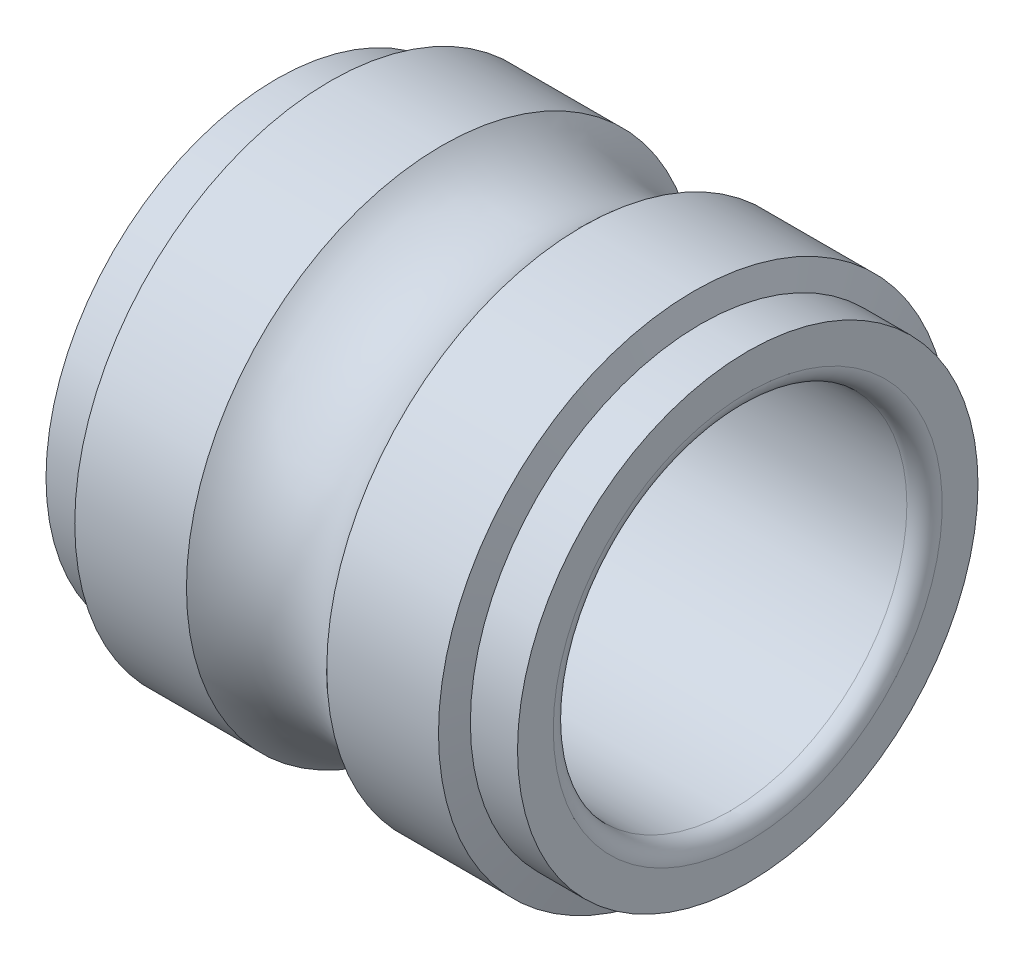
ISO-10303-21;
HEADER;
FILE_DESCRIPTION(('STEP AP214'),'2;1');
FILE_NAME('part.step','',(''),(''),'','','');
FILE_SCHEMA(('AUTOMOTIVE_DESIGN { 1 0 10303 214 1 1 1 1 }'));
ENDSEC;
DATA;
#1=APPLICATION_CONTEXT('core data for automotive mechanical design processes');
#2=APPLICATION_PROTOCOL_DEFINITION('international standard','automotive_design',2000,#1);
#3=PRODUCT_CONTEXT('',#1,'mechanical');
#4=PRODUCT('Part','Part','',(#3));
#5=PRODUCT_RELATED_PRODUCT_CATEGORY('part','',(#4));
#6=PRODUCT_DEFINITION_FORMATION('','',#4);
#7=PRODUCT_DEFINITION_CONTEXT('part definition',#1,'design');
#8=PRODUCT_DEFINITION('design','',#6,#7);
#9=PRODUCT_DEFINITION_SHAPE('','',#8);
#10=(LENGTH_UNIT() NAMED_UNIT(*) SI_UNIT(.MILLI.,.METRE.));
#11=(NAMED_UNIT(*) PLANE_ANGLE_UNIT() SI_UNIT($,.RADIAN.));
#12=(NAMED_UNIT(*) SI_UNIT($,.STERADIAN.) SOLID_ANGLE_UNIT());
#13=UNCERTAINTY_MEASURE_WITH_UNIT(LENGTH_MEASURE(1.E-05),#10,'distance_accuracy_value','');
#14=(GEOMETRIC_REPRESENTATION_CONTEXT(3) GLOBAL_UNCERTAINTY_ASSIGNED_CONTEXT((#13)) GLOBAL_UNIT_ASSIGNED_CONTEXT((#10,
#11,#12)) REPRESENTATION_CONTEXT('',''));
#15=CARTESIAN_POINT('',(0.,0.,0.));
#16=DIRECTION('',(0.,0.,1.));
#17=DIRECTION('',(1.,0.,0.));
#18=AXIS2_PLACEMENT_3D('',#15,#16,#17);
#19=CARTESIAN_POINT('',(0.15,0.,0.));
#20=DIRECTION('',(-1.,0.,0.));
#21=DIRECTION('',(0.,0.,1.));
#22=AXIS2_PLACEMENT_3D('',#19,#20,#21);
#23=CYLINDRICAL_SURFACE('',#22,2.16666666666667);
#24=CARTESIAN_POINT('',(2.5951190357119,0.,0.));
#25=DIRECTION('',(-1.,0.,0.));
#26=DIRECTION('',(0.,0.,1.));
#27=AXIS2_PLACEMENT_3D('',#24,#25,#26);
#28=CIRCLE('',#27,2.16666666666667);
#29=CARTESIAN_POINT('',(2.5951190357119,0.,2.16666666666667));
#30=VERTEX_POINT('',#29);
#31=EDGE_CURVE('E42',#30,#30,#28,.F.);
#32=ORIENTED_EDGE('',*,*,#31,.T.);
#33=EDGE_LOOP('',(#32));
#34=FACE_BOUND('',#33,.T.);
#35=CARTESIAN_POINT('',(3.54283750561469,0.,0.));
#36=DIRECTION('',(-1.,0.,0.));
#37=DIRECTION('',(0.,0.,1.));
#38=AXIS2_PLACEMENT_3D('',#35,#36,#37);
#39=CIRCLE('',#38,2.16666666666667);
#40=CARTESIAN_POINT('',(3.54283750561469,0.,2.16666666666667));
#41=VERTEX_POINT('',#40);
#42=EDGE_CURVE('E19',#41,#41,#39,.F.);
#43=ORIENTED_EDGE('',*,*,#42,.F.);
#44=EDGE_LOOP('',(#43));
#45=FACE_BOUND('',#44,.T.);
#46=ADVANCED_FACE('F15',(#34,#45),#23,.T.);
#47=CARTESIAN_POINT('',(4.,1.65,0.));
#48=DIRECTION('',(-1.,0.,0.));
#49=DIRECTION('',(0.,0.,1.));
#50=AXIS2_PLACEMENT_3D('',#47,#48,#49);
#51=PLANE('',#50);
#52=CARTESIAN_POINT('',(4.,0.,0.));
#53=DIRECTION('',(-1.,0.,0.));
#54=DIRECTION('',(0.,0.,1.));
#55=AXIS2_PLACEMENT_3D('',#52,#53,#54);
#56=CIRCLE('',#55,1.65);
#57=CARTESIAN_POINT('',(4.,0.,1.65));
#58=VERTEX_POINT('',#57);
#59=EDGE_CURVE('E34',#58,#58,#56,.T.);
#60=ORIENTED_EDGE('',*,*,#59,.T.);
#61=EDGE_LOOP('',(#60));
#62=FACE_BOUND('',#61,.T.);
#63=CARTESIAN_POINT('',(4.,0.,0.));
#64=DIRECTION('',(-1.,0.,0.));
#65=DIRECTION('',(0.,0.,1.));
#66=AXIS2_PLACEMENT_3D('',#63,#64,#65);
#67=CIRCLE('',#66,1.95333333333334);
#68=CARTESIAN_POINT('',(4.,0.,1.95333333333334));
#69=VERTEX_POINT('',#68);
#70=EDGE_CURVE('E55',#69,#69,#67,.T.);
#71=ORIENTED_EDGE('',*,*,#70,.F.);
#72=EDGE_LOOP('',(#71));
#73=FACE_BOUND('',#72,.T.);
#74=ADVANCED_FACE('F85',(#62,#73),#51,.F.);
#75=CARTESIAN_POINT('',(1.4048809642881,0.,0.));
#76=DIRECTION('',(1.,0.,0.));
#77=DIRECTION('',(0.,0.,-1.));
#78=AXIS2_PLACEMENT_3D('',#75,#76,#77);
#79=CIRCLE('',#78,2.16666666666667);
#80=CARTESIAN_POINT('',(1.4048809642881,0.,-2.16666666666667));
#81=VERTEX_POINT('',#80);
#82=EDGE_CURVE('E38',#81,#81,#79,.F.);
#83=ORIENTED_EDGE('',*,*,#82,.T.);
#84=EDGE_LOOP('',(#83));
#85=FACE_BOUND('',#84,.T.);
#86=CARTESIAN_POINT('',(0.457162494385307,0.,0.));
#87=DIRECTION('',(1.,0.,0.));
#88=DIRECTION('',(0.,0.,-1.));
#89=AXIS2_PLACEMENT_3D('',#86,#87,#88);
#90=CIRCLE('',#89,2.16666666666667);
#91=CARTESIAN_POINT('',(0.457162494385307,0.,-2.16666666666667));
#92=VERTEX_POINT('',#91);
#93=EDGE_CURVE('E43',#92,#92,#90,.F.);
#94=ORIENTED_EDGE('',*,*,#93,.F.);
#95=EDGE_LOOP('',(#94));
#96=FACE_BOUND('',#95,.T.);
#97=ADVANCED_FACE('F106',(#85,#96),#23,.T.);
#98=CARTESIAN_POINT('',(0.,1.65,0.));
#99=DIRECTION('',(-1.,0.,0.));
#100=DIRECTION('',(0.,0.,1.));
#101=AXIS2_PLACEMENT_3D('',#98,#99,#100);
#102=PLANE('',#101);
#103=CARTESIAN_POINT('',(0.,0.,0.));
#104=DIRECTION('',(-1.,0.,0.));
#105=DIRECTION('',(0.,0.,1.));
#106=AXIS2_PLACEMENT_3D('',#103,#104,#105);
#107=CIRCLE('',#106,1.65);
#108=CARTESIAN_POINT('',(0.,0.,1.65));
#109=VERTEX_POINT('',#108);
#110=EDGE_CURVE('E47',#109,#109,#107,.T.);
#111=ORIENTED_EDGE('',*,*,#110,.F.);
#112=EDGE_LOOP('',(#111));
#113=FACE_BOUND('',#112,.T.);
#114=CARTESIAN_POINT('',(0.,0.,0.));
#115=DIRECTION('',(-1.,0.,0.));
#116=DIRECTION('',(0.,0.,1.));
#117=AXIS2_PLACEMENT_3D('',#114,#115,#116);
#118=CIRCLE('',#117,1.95333333333334);
#119=CARTESIAN_POINT('',(0.,0.,1.95333333333334));
#120=VERTEX_POINT('',#119);
#121=EDGE_CURVE('E48',#120,#120,#118,.T.);
#122=ORIENTED_EDGE('',*,*,#121,.T.);
#123=EDGE_LOOP('',(#122));
#124=FACE_BOUND('',#123,.T.);
#125=ADVANCED_FACE('F101',(#113,#124),#102,.T.);
#126=CARTESIAN_POINT('',(0.15,0.,0.));
#127=DIRECTION('',(-1.,0.,0.));
#128=DIRECTION('',(0.,0.,1.));
#129=AXIS2_PLACEMENT_3D('',#126,#127,#128);
#130=TOROIDAL_SURFACE('',#129,1.65,0.15);
#131=CARTESIAN_POINT('',(0.15,0.,0.));
#132=DIRECTION('',(-1.,0.,0.));
#133=DIRECTION('',(0.,0.,1.));
#134=AXIS2_PLACEMENT_3D('',#131,#132,#133);
#135=CIRCLE('',#134,1.5);
#136=CARTESIAN_POINT('',(0.15,0.,1.5));
#137=VERTEX_POINT('',#136);
#138=EDGE_CURVE('E10',#137,#137,#135,.T.);
#139=ORIENTED_EDGE('',*,*,#138,.F.);
#140=EDGE_LOOP('',(#139));
#141=FACE_BOUND('',#140,.T.);
#142=ORIENTED_EDGE('',*,*,#110,.T.);
#143=EDGE_LOOP('',(#142));
#144=FACE_BOUND('',#143,.T.);
#145=ADVANCED_FACE('F17',(#141,#144),#130,.T.);
#146=CARTESIAN_POINT('',(0.15,0.,0.));
#147=DIRECTION('',(-1.,0.,0.));
#148=DIRECTION('',(0.,0.,1.));
#149=AXIS2_PLACEMENT_3D('',#146,#147,#148);
#150=CYLINDRICAL_SURFACE('',#149,1.5);
#151=CARTESIAN_POINT('',(3.85,0.,0.));
#152=DIRECTION('',(-1.,0.,0.));
#153=DIRECTION('',(0.,0.,1.));
#154=AXIS2_PLACEMENT_3D('',#151,#152,#153);
#155=CIRCLE('',#154,1.5);
#156=CARTESIAN_POINT('',(3.85,0.,1.5));
#157=VERTEX_POINT('',#156);
#158=EDGE_CURVE('E24',#157,#157,#155,.T.);
#159=ORIENTED_EDGE('',*,*,#158,.F.);
#160=EDGE_LOOP('',(#159));
#161=FACE_BOUND('',#160,.T.);
#162=ORIENTED_EDGE('',*,*,#138,.T.);
#163=EDGE_LOOP('',(#162));
#164=FACE_BOUND('',#163,.T.);
#165=ADVANCED_FACE('F92',(#161,#164),#150,.F.);
#166=CARTESIAN_POINT('',(3.85,0.,0.));
#167=DIRECTION('',(-1.,0.,0.));
#168=DIRECTION('',(0.,0.,1.));
#169=AXIS2_PLACEMENT_3D('',#166,#167,#168);
#170=TOROIDAL_SURFACE('',#169,1.65,0.15);
#171=ORIENTED_EDGE('',*,*,#59,.F.);
#172=EDGE_LOOP('',(#171));
#173=FACE_BOUND('',#172,.T.);
#174=ORIENTED_EDGE('',*,*,#158,.T.);
#175=EDGE_LOOP('',(#174));
#176=FACE_BOUND('',#175,.T.);
#177=ADVANCED_FACE('F88',(#173,#176),#170,.T.);
#178=CARTESIAN_POINT('',(2.,0.,0.));
#179=DIRECTION('',(1.,0.,0.));
#180=DIRECTION('',(0.,-1.,0.));
#181=AXIS2_PLACEMENT_3D('',#178,#179,#180);
#182=TOROIDAL_SURFACE('',#181,2.75,0.833333333333334);
#183=ORIENTED_EDGE('',*,*,#82,.F.);
#184=EDGE_LOOP('',(#183));
#185=FACE_BOUND('',#184,.T.);
#186=ORIENTED_EDGE('',*,*,#31,.F.);
#187=EDGE_LOOP('',(#186));
#188=FACE_BOUND('',#187,.T.);
#189=ADVANCED_FACE('F91',(#185,#188),#182,.F.);
#190=CARTESIAN_POINT('',(0.4,0.,0.));
#191=DIRECTION('',(1.,0.,0.));
#192=DIRECTION('',(0.,0.,-1.));
#193=AXIS2_PLACEMENT_3D('',#190,#191,#192);
#194=CONICAL_SURFACE('',#193,1.95333333333334,1.30899693899575);
#195=CARTESIAN_POINT('',(0.4,0.,0.));
#196=DIRECTION('',(-1.,0.,0.));
#197=DIRECTION('',(0.,0.,1.));
#198=AXIS2_PLACEMENT_3D('',#195,#196,#197);
#199=CIRCLE('',#198,1.95333333333334);
#200=CARTESIAN_POINT('',(0.4,0.,1.95333333333334));
#201=VERTEX_POINT('',#200);
#202=EDGE_CURVE('E52',#201,#201,#199,.T.);
#203=ORIENTED_EDGE('',*,*,#202,.F.);
#204=EDGE_LOOP('',(#203));
#205=FACE_BOUND('',#204,.T.);
#206=ORIENTED_EDGE('',*,*,#93,.T.);
#207=EDGE_LOOP('',(#206));
#208=FACE_BOUND('',#207,.T.);
#209=ADVANCED_FACE('F123',(#205,#208),#194,.T.);
#210=CARTESIAN_POINT('',(-1.,0.,0.));
#211=DIRECTION('',(-1.,0.,0.));
#212=DIRECTION('',(0.,0.,1.));
#213=AXIS2_PLACEMENT_3D('',#210,#211,#212);
#214=CYLINDRICAL_SURFACE('',#213,1.95333333333334);
#215=ORIENTED_EDGE('',*,*,#121,.F.);
#216=EDGE_LOOP('',(#215));
#217=FACE_BOUND('',#216,.T.);
#218=ORIENTED_EDGE('',*,*,#202,.T.);
#219=EDGE_LOOP('',(#218));
#220=FACE_BOUND('',#219,.T.);
#221=ADVANCED_FACE('F125',(#217,#220),#214,.T.);
#222=CARTESIAN_POINT('',(3.6,0.,0.));
#223=DIRECTION('',(-1.,0.,0.));
#224=DIRECTION('',(0.,0.,1.));
#225=AXIS2_PLACEMENT_3D('',#222,#223,#224);
#226=CONICAL_SURFACE('',#225,1.95333333333334,1.30899693899575);
#227=CARTESIAN_POINT('',(3.6,0.,0.));
#228=DIRECTION('',(1.,0.,0.));
#229=DIRECTION('',(0.,0.,-1.));
#230=AXIS2_PLACEMENT_3D('',#227,#228,#229);
#231=CIRCLE('',#230,1.95333333333334);
#232=CARTESIAN_POINT('',(3.6,0.,-1.95333333333334));
#233=VERTEX_POINT('',#232);
#234=EDGE_CURVE('E58',#233,#233,#231,.T.);
#235=ORIENTED_EDGE('',*,*,#234,.F.);
#236=EDGE_LOOP('',(#235));
#237=FACE_BOUND('',#236,.T.);
#238=ORIENTED_EDGE('',*,*,#42,.T.);
#239=EDGE_LOOP('',(#238));
#240=FACE_BOUND('',#239,.T.);
#241=ADVANCED_FACE('F132',(#237,#240),#226,.T.);
#242=CARTESIAN_POINT('',(5.,0.,0.));
#243=DIRECTION('',(1.,0.,0.));
#244=DIRECTION('',(0.,0.,-1.));
#245=AXIS2_PLACEMENT_3D('',#242,#243,#244);
#246=CYLINDRICAL_SURFACE('',#245,1.95333333333334);
#247=ORIENTED_EDGE('',*,*,#234,.T.);
#248=EDGE_LOOP('',(#247));
#249=FACE_BOUND('',#248,.T.);
#250=ORIENTED_EDGE('',*,*,#70,.T.);
#251=EDGE_LOOP('',(#250));
#252=FACE_BOUND('',#251,.T.);
#253=ADVANCED_FACE('F141',(#249,#252),#246,.T.);
#254=CLOSED_SHELL('',(#46,#74,#97,#125,#145,#165,#177,#189,#209,#221,#241,#253));
#255=MANIFOLD_SOLID_BREP('B1',#254);
#256=ADVANCED_BREP_SHAPE_REPRESENTATION('',(#18,#255),#14);
#257=SHAPE_DEFINITION_REPRESENTATION(#9,#256);
ENDSEC;
END-ISO-10303-21;
